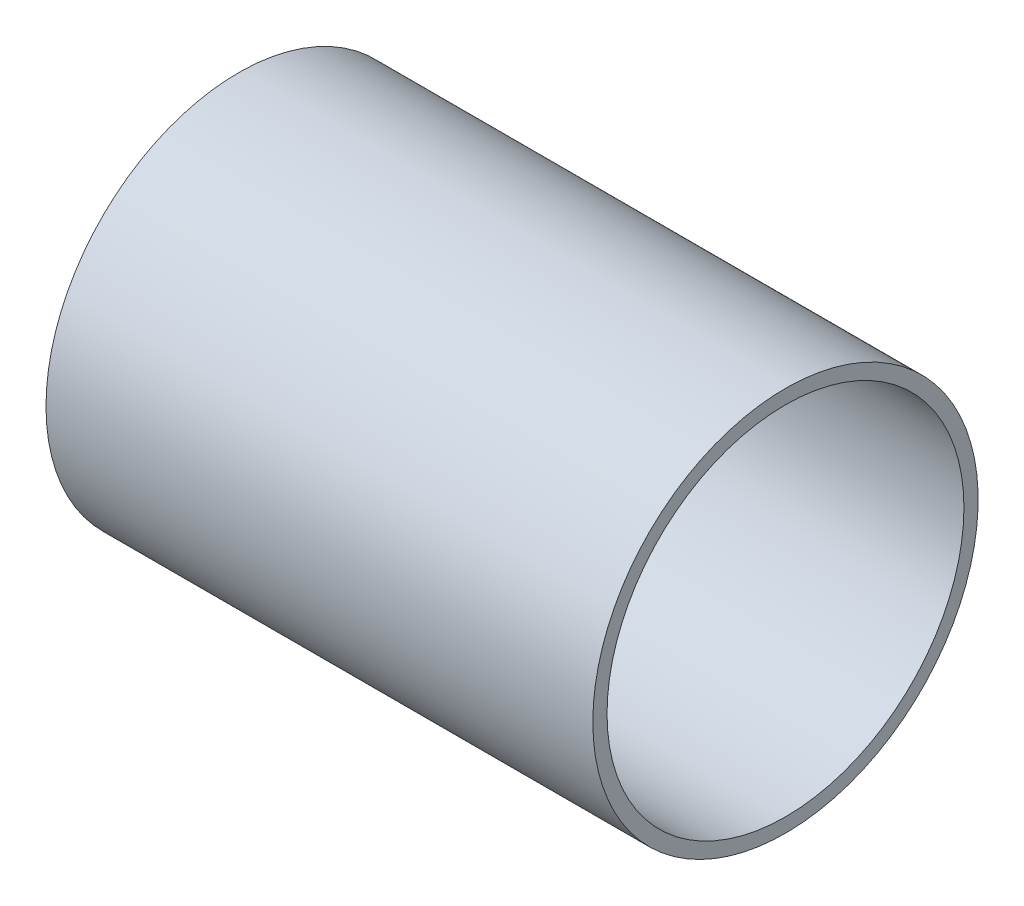
ISO-10303-21;
HEADER;
FILE_DESCRIPTION(('STEP AP214'),'2;1');
FILE_NAME('part.step','',(''),(''),'','','');
FILE_SCHEMA(('AUTOMOTIVE_DESIGN { 1 0 10303 214 1 1 1 1 }'));
ENDSEC;
DATA;
#1=APPLICATION_CONTEXT('core data for automotive mechanical design processes');
#2=APPLICATION_PROTOCOL_DEFINITION('international standard','automotive_design',2000,#1);
#3=PRODUCT_CONTEXT('',#1,'mechanical');
#4=PRODUCT('Part','Part','',(#3));
#5=PRODUCT_RELATED_PRODUCT_CATEGORY('part','',(#4));
#6=PRODUCT_DEFINITION_FORMATION('','',#4);
#7=PRODUCT_DEFINITION_CONTEXT('part definition',#1,'design');
#8=PRODUCT_DEFINITION('design','',#6,#7);
#9=PRODUCT_DEFINITION_SHAPE('','',#8);
#10=(LENGTH_UNIT() NAMED_UNIT(*) SI_UNIT(.MILLI.,.METRE.));
#11=(NAMED_UNIT(*) PLANE_ANGLE_UNIT() SI_UNIT($,.RADIAN.));
#12=(NAMED_UNIT(*) SI_UNIT($,.STERADIAN.) SOLID_ANGLE_UNIT());
#13=UNCERTAINTY_MEASURE_WITH_UNIT(LENGTH_MEASURE(1.E-05),#10,'distance_accuracy_value','');
#14=(GEOMETRIC_REPRESENTATION_CONTEXT(3) GLOBAL_UNCERTAINTY_ASSIGNED_CONTEXT((#13)) GLOBAL_UNIT_ASSIGNED_CONTEXT((#10,
#11,#12)) REPRESENTATION_CONTEXT('',''));
#15=CARTESIAN_POINT('',(0.,0.,0.));
#16=DIRECTION('',(0.,0.,1.));
#17=DIRECTION('',(1.,0.,0.));
#18=AXIS2_PLACEMENT_3D('',#15,#16,#17);
#19=CARTESIAN_POINT('',(100.092447703533,-199.389340658954,-22.0425890832618));
#20=DIRECTION('',(-1.,0.,0.));
#21=DIRECTION('',(0.,0.,1.));
#22=AXIS2_PLACEMENT_3D('',#19,#20,#21);
#23=CYLINDRICAL_SURFACE('',#22,6.62251387520381);
#24=CARTESIAN_POINT('',(81.2964477035325,-199.389340658954,-22.0425890832618));
#25=DIRECTION('',(-1.,0.,0.));
#26=DIRECTION('',(0.,0.,1.));
#27=AXIS2_PLACEMENT_3D('',#24,#25,#26);
#28=CIRCLE('',#27,6.62251387520381);
#29=CARTESIAN_POINT('',(81.2964477035325,-199.389340658954,-15.420075208058));
#30=VERTEX_POINT('',#29);
#31=EDGE_CURVE('E19',#30,#30,#28,.T.);
#32=ORIENTED_EDGE('',*,*,#31,.F.);
#33=EDGE_LOOP('',(#32));
#34=FACE_BOUND('',#33,.T.);
#35=CARTESIAN_POINT('',(100.092447703533,-199.389340658954,-22.0425890832618));
#36=DIRECTION('',(-1.,0.,0.));
#37=DIRECTION('',(0.,0.,1.));
#38=AXIS2_PLACEMENT_3D('',#35,#36,#37);
#39=CIRCLE('',#38,6.62251387520381);
#40=CARTESIAN_POINT('',(100.092447703533,-199.389340658954,-15.420075208058));
#41=VERTEX_POINT('',#40);
#42=EDGE_CURVE('E28',#41,#41,#39,.F.);
#43=ORIENTED_EDGE('',*,*,#42,.F.);
#44=EDGE_LOOP('',(#43));
#45=FACE_BOUND('',#44,.T.);
#46=ADVANCED_FACE('F15',(#34,#45),#23,.T.);
#47=CARTESIAN_POINT('',(81.2964477035325,-192.74142678375,-28.6905029584656));
#48=DIRECTION('',(-1.,0.,0.));
#49=DIRECTION('',(0.,-1.,0.));
#50=AXIS2_PLACEMENT_3D('',#47,#48,#49);
#51=PLANE('',#50);
#52=CARTESIAN_POINT('',(81.2964477035325,-199.389340658954,-22.0425890832618));
#53=DIRECTION('',(1.,0.,0.));
#54=DIRECTION('',(0.,0.,-1.));
#55=AXIS2_PLACEMENT_3D('',#52,#53,#54);
#56=CIRCLE('',#55,6.13392853346152);
#57=CARTESIAN_POINT('',(81.2964477035325,-199.389340658954,-28.1765176167234));
#58=VERTEX_POINT('',#57);
#59=EDGE_CURVE('E23',#58,#58,#56,.F.);
#60=ORIENTED_EDGE('',*,*,#59,.F.);
#61=EDGE_LOOP('',(#60));
#62=FACE_BOUND('',#61,.T.);
#63=ORIENTED_EDGE('',*,*,#31,.T.);
#64=EDGE_LOOP('',(#63));
#65=FACE_BOUND('',#64,.T.);
#66=ADVANCED_FACE('F36',(#62,#65),#51,.T.);
#67=CARTESIAN_POINT('',(100.092447703533,-206.037254534158,-28.6905029584656));
#68=DIRECTION('',(1.,0.,0.));
#69=DIRECTION('',(0.,1.,0.));
#70=AXIS2_PLACEMENT_3D('',#67,#68,#69);
#71=PLANE('',#70);
#72=CARTESIAN_POINT('',(100.092447703533,-199.389340658954,-22.0425890832618));
#73=DIRECTION('',(1.,0.,0.));
#74=DIRECTION('',(0.,0.,-1.));
#75=AXIS2_PLACEMENT_3D('',#72,#73,#74);
#76=CIRCLE('',#75,6.13392853346152);
#77=CARTESIAN_POINT('',(100.092447703533,-199.389340658954,-28.1765176167234));
#78=VERTEX_POINT('',#77);
#79=EDGE_CURVE('E10',#78,#78,#76,.T.);
#80=ORIENTED_EDGE('',*,*,#79,.F.);
#81=EDGE_LOOP('',(#80));
#82=FACE_BOUND('',#81,.T.);
#83=ORIENTED_EDGE('',*,*,#42,.T.);
#84=EDGE_LOOP('',(#83));
#85=FACE_BOUND('',#84,.T.);
#86=ADVANCED_FACE('F45',(#82,#85),#71,.T.);
#87=CARTESIAN_POINT('',(81.2964477035325,-199.389340658954,-22.0425890832618));
#88=DIRECTION('',(1.,0.,0.));
#89=DIRECTION('',(0.,0.,-1.));
#90=AXIS2_PLACEMENT_3D('',#87,#88,#89);
#91=CYLINDRICAL_SURFACE('',#90,6.13392853346152);
#92=ORIENTED_EDGE('',*,*,#79,.T.);
#93=EDGE_LOOP('',(#92));
#94=FACE_BOUND('',#93,.T.);
#95=ORIENTED_EDGE('',*,*,#59,.T.);
#96=EDGE_LOOP('',(#95));
#97=FACE_BOUND('',#96,.T.);
#98=ADVANCED_FACE('F17',(#94,#97),#91,.F.);
#99=CLOSED_SHELL('',(#46,#66,#86,#98));
#100=MANIFOLD_SOLID_BREP('B1',#99);
#101=ADVANCED_BREP_SHAPE_REPRESENTATION('',(#18,#100),#14);
#102=SHAPE_DEFINITION_REPRESENTATION(#9,#101);
ENDSEC;
END-ISO-10303-21;
